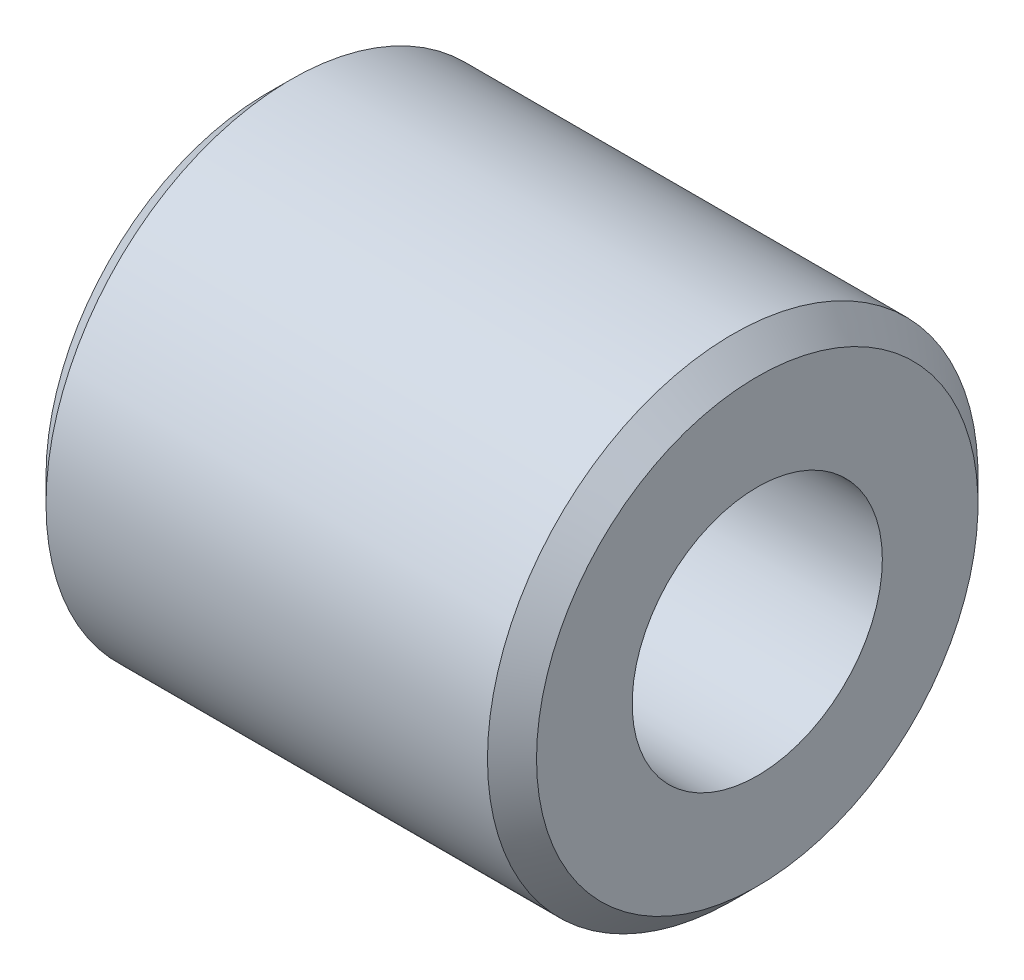
ISO-10303-21;
HEADER;
FILE_DESCRIPTION(('STEP AP214'),'2;1');
FILE_NAME('part.step','',(''),(''),'','','');
FILE_SCHEMA(('AUTOMOTIVE_DESIGN { 1 0 10303 214 1 1 1 1 }'));
ENDSEC;
DATA;
#1=APPLICATION_CONTEXT('core data for automotive mechanical design processes');
#2=APPLICATION_PROTOCOL_DEFINITION('international standard','automotive_design',2000,#1);
#3=PRODUCT_CONTEXT('',#1,'mechanical');
#4=PRODUCT('Part','Part','',(#3));
#5=PRODUCT_RELATED_PRODUCT_CATEGORY('part','',(#4));
#6=PRODUCT_DEFINITION_FORMATION('','',#4);
#7=PRODUCT_DEFINITION_CONTEXT('part definition',#1,'design');
#8=PRODUCT_DEFINITION('design','',#6,#7);
#9=PRODUCT_DEFINITION_SHAPE('','',#8);
#10=(LENGTH_UNIT() NAMED_UNIT(*) SI_UNIT(.MILLI.,.METRE.));
#11=(NAMED_UNIT(*) PLANE_ANGLE_UNIT() SI_UNIT($,.RADIAN.));
#12=(NAMED_UNIT(*) SI_UNIT($,.STERADIAN.) SOLID_ANGLE_UNIT());
#13=UNCERTAINTY_MEASURE_WITH_UNIT(LENGTH_MEASURE(1.E-05),#10,'distance_accuracy_value','');
#14=(GEOMETRIC_REPRESENTATION_CONTEXT(3) GLOBAL_UNCERTAINTY_ASSIGNED_CONTEXT((#13)) GLOBAL_UNIT_ASSIGNED_CONTEXT((#10,
#11,#12)) REPRESENTATION_CONTEXT('',''));
#15=CARTESIAN_POINT('',(0.,0.,0.));
#16=DIRECTION('',(0.,0.,1.));
#17=DIRECTION('',(1.,0.,0.));
#18=AXIS2_PLACEMENT_3D('',#15,#16,#17);
#19=CARTESIAN_POINT('',(0.,9.00000000000001,0.));
#20=DIRECTION('',(-1.,0.,0.));
#21=DIRECTION('',(0.,0.,1.));
#22=AXIS2_PLACEMENT_3D('',#19,#20,#21);
#23=PLANE('',#22);
#24=CARTESIAN_POINT('',(0.,0.,0.));
#25=DIRECTION('',(1.,0.,0.));
#26=DIRECTION('',(0.,0.,-1.));
#27=AXIS2_PLACEMENT_3D('',#24,#25,#26);
#28=CIRCLE('',#27,5.09999999999999);
#29=CARTESIAN_POINT('',(0.,0.,-5.09999999999999));
#30=VERTEX_POINT('',#29);
#31=EDGE_CURVE('E49',#30,#30,#28,.T.);
#32=ORIENTED_EDGE('',*,*,#31,.F.);
#33=EDGE_LOOP('',(#32));
#34=FACE_BOUND('',#33,.T.);
#35=CARTESIAN_POINT('',(0.,0.,0.));
#36=DIRECTION('',(-1.,0.,0.));
#37=DIRECTION('',(0.,0.,1.));
#38=AXIS2_PLACEMENT_3D('',#35,#36,#37);
#39=CIRCLE('',#38,9.00000000000001);
#40=CARTESIAN_POINT('',(0.,0.,9.00000000000001));
#41=VERTEX_POINT('',#40);
#42=EDGE_CURVE('E44',#41,#41,#39,.T.);
#43=ORIENTED_EDGE('',*,*,#42,.F.);
#44=EDGE_LOOP('',(#43));
#45=FACE_BOUND('',#44,.T.);
#46=ADVANCED_FACE('F30',(#34,#45),#23,.F.);
#47=CARTESIAN_POINT('',(-20.,0.,0.));
#48=DIRECTION('',(1.,0.,0.));
#49=DIRECTION('',(0.,0.,-1.));
#50=AXIS2_PLACEMENT_3D('',#47,#48,#49);
#51=PLANE('',#50);
#52=CARTESIAN_POINT('',(-20.,0.,0.));
#53=DIRECTION('',(1.,0.,0.));
#54=DIRECTION('',(0.,0.,-1.));
#55=AXIS2_PLACEMENT_3D('',#52,#53,#54);
#56=CIRCLE('',#55,5.09999999999999);
#57=CARTESIAN_POINT('',(-20.,0.,-5.09999999999999));
#58=VERTEX_POINT('',#57);
#59=EDGE_CURVE('E52',#58,#58,#56,.T.);
#60=ORIENTED_EDGE('',*,*,#59,.T.);
#61=EDGE_LOOP('',(#60));
#62=FACE_BOUND('',#61,.T.);
#63=CARTESIAN_POINT('',(-20.,0.,0.));
#64=DIRECTION('',(-1.,0.,0.));
#65=DIRECTION('',(0.,0.,1.));
#66=AXIS2_PLACEMENT_3D('',#63,#64,#65);
#67=CIRCLE('',#66,9.00000000000001);
#68=CARTESIAN_POINT('',(-20.,0.,9.00000000000001));
#69=VERTEX_POINT('',#68);
#70=EDGE_CURVE('E10',#69,#69,#67,.T.);
#71=ORIENTED_EDGE('',*,*,#70,.T.);
#72=EDGE_LOOP('',(#71));
#73=FACE_BOUND('',#72,.T.);
#74=ADVANCED_FACE('F56',(#62,#73),#51,.F.);
#75=CARTESIAN_POINT('',(-19.,0.,0.));
#76=DIRECTION('',(1.,0.,0.));
#77=DIRECTION('',(0.,0.,-1.));
#78=AXIS2_PLACEMENT_3D('',#75,#76,#77);
#79=CONICAL_SURFACE('',#78,10.,0.785398163397447);
#80=ORIENTED_EDGE('',*,*,#70,.F.);
#81=EDGE_LOOP('',(#80));
#82=FACE_BOUND('',#81,.T.);
#83=CARTESIAN_POINT('',(-19.,0.,0.));
#84=DIRECTION('',(-1.,0.,0.));
#85=DIRECTION('',(0.,0.,1.));
#86=AXIS2_PLACEMENT_3D('',#83,#84,#85);
#87=CIRCLE('',#86,10.);
#88=CARTESIAN_POINT('',(-19.,0.,10.));
#89=VERTEX_POINT('',#88);
#90=EDGE_CURVE('E36',#89,#89,#87,.T.);
#91=ORIENTED_EDGE('',*,*,#90,.T.);
#92=EDGE_LOOP('',(#91));
#93=FACE_BOUND('',#92,.T.);
#94=ADVANCED_FACE('F76',(#82,#93),#79,.T.);
#95=CARTESIAN_POINT('',(-22.0390516715447,0.,0.));
#96=DIRECTION('',(-1.,0.,0.));
#97=DIRECTION('',(0.,0.,1.));
#98=AXIS2_PLACEMENT_3D('',#95,#96,#97);
#99=CYLINDRICAL_SURFACE('',#98,10.);
#100=ORIENTED_EDGE('',*,*,#90,.F.);
#101=EDGE_LOOP('',(#100));
#102=FACE_BOUND('',#101,.T.);
#103=CARTESIAN_POINT('',(-1.,0.,0.));
#104=DIRECTION('',(-1.,0.,0.));
#105=DIRECTION('',(0.,0.,1.));
#106=AXIS2_PLACEMENT_3D('',#103,#104,#105);
#107=CIRCLE('',#106,10.);
#108=CARTESIAN_POINT('',(-1.,0.,10.));
#109=VERTEX_POINT('',#108);
#110=EDGE_CURVE('E40',#109,#109,#107,.T.);
#111=ORIENTED_EDGE('',*,*,#110,.T.);
#112=EDGE_LOOP('',(#111));
#113=FACE_BOUND('',#112,.T.);
#114=ADVANCED_FACE('F70',(#102,#113),#99,.T.);
#115=CARTESIAN_POINT('',(0.,0.,0.));
#116=DIRECTION('',(-1.,0.,0.));
#117=DIRECTION('',(0.,0.,1.));
#118=AXIS2_PLACEMENT_3D('',#115,#116,#117);
#119=CONICAL_SURFACE('',#118,9.00000000000001,0.785398163397448);
#120=ORIENTED_EDGE('',*,*,#110,.F.);
#121=EDGE_LOOP('',(#120));
#122=FACE_BOUND('',#121,.T.);
#123=ORIENTED_EDGE('',*,*,#42,.T.);
#124=EDGE_LOOP('',(#123));
#125=FACE_BOUND('',#124,.T.);
#126=ADVANCED_FACE('F61',(#122,#125),#119,.T.);
#127=CARTESIAN_POINT('',(0.,0.,0.));
#128=DIRECTION('',(1.,0.,0.));
#129=DIRECTION('',(0.,0.,-1.));
#130=AXIS2_PLACEMENT_3D('',#127,#128,#129);
#131=CYLINDRICAL_SURFACE('',#130,5.09999999999999);
#132=ORIENTED_EDGE('',*,*,#59,.F.);
#133=EDGE_LOOP('',(#132));
#134=FACE_BOUND('',#133,.T.);
#135=ORIENTED_EDGE('',*,*,#31,.T.);
#136=EDGE_LOOP('',(#135));
#137=FACE_BOUND('',#136,.T.);
#138=ADVANCED_FACE('F58',(#134,#137),#131,.F.);
#139=CLOSED_SHELL('',(#46,#74,#94,#114,#126,#138));
#140=MANIFOLD_SOLID_BREP('B2',#139);
#141=ADVANCED_BREP_SHAPE_REPRESENTATION('',(#18,#140),#14);
#142=SHAPE_DEFINITION_REPRESENTATION(#9,#141);
ENDSEC;
END-ISO-10303-21;
